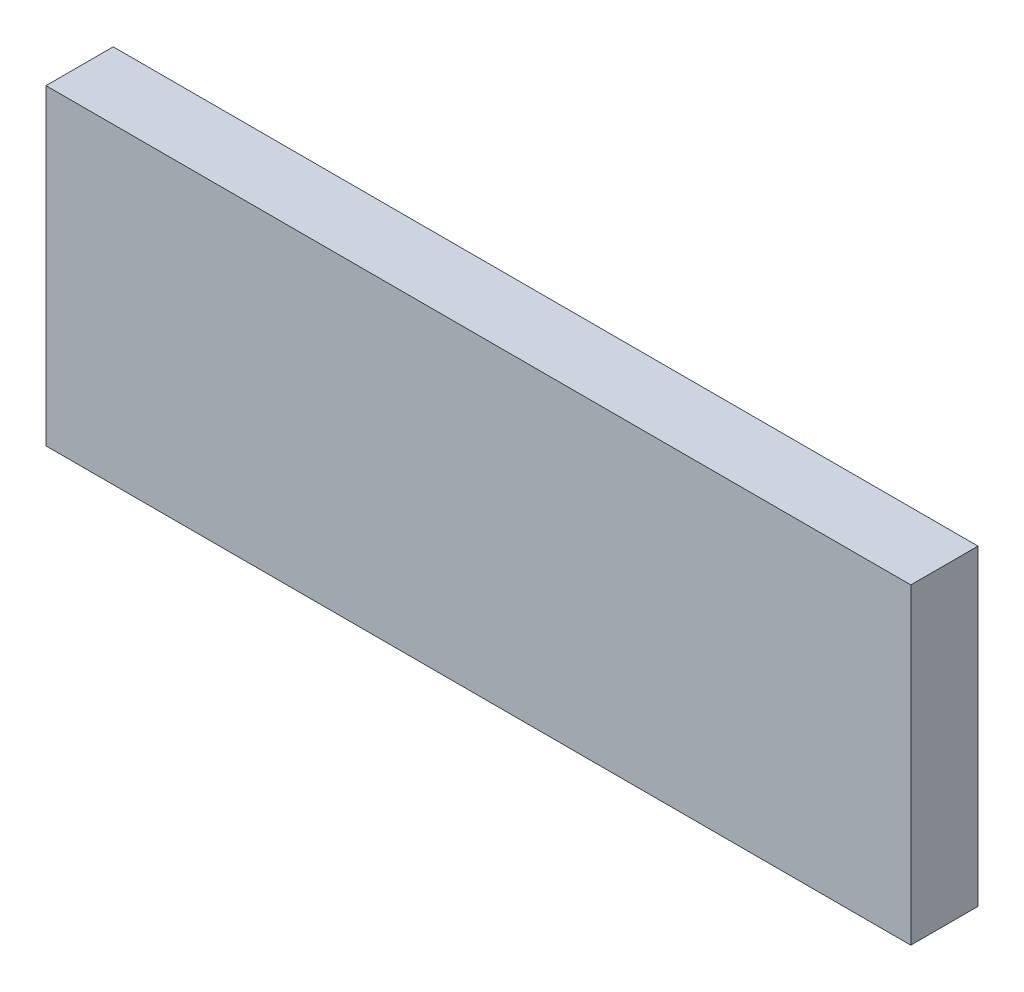
ISO-10303-21;
HEADER;
FILE_DESCRIPTION(('STEP AP214'),'2;1');
FILE_NAME('part.step','',(''),(''),'','','');
FILE_SCHEMA(('AUTOMOTIVE_DESIGN { 1 0 10303 214 1 1 1 1 }'));
ENDSEC;
DATA;
#1=APPLICATION_CONTEXT('core data for automotive mechanical design processes');
#2=APPLICATION_PROTOCOL_DEFINITION('international standard','automotive_design',2000,#1);
#3=PRODUCT_CONTEXT('',#1,'mechanical');
#4=PRODUCT('Part','Part','',(#3));
#5=PRODUCT_RELATED_PRODUCT_CATEGORY('part','',(#4));
#6=PRODUCT_DEFINITION_FORMATION('','',#4);
#7=PRODUCT_DEFINITION_CONTEXT('part definition',#1,'design');
#8=PRODUCT_DEFINITION('design','',#6,#7);
#9=PRODUCT_DEFINITION_SHAPE('','',#8);
#10=(LENGTH_UNIT() NAMED_UNIT(*) SI_UNIT(.MILLI.,.METRE.));
#11=(NAMED_UNIT(*) PLANE_ANGLE_UNIT() SI_UNIT($,.RADIAN.));
#12=(NAMED_UNIT(*) SI_UNIT($,.STERADIAN.) SOLID_ANGLE_UNIT());
#13=UNCERTAINTY_MEASURE_WITH_UNIT(LENGTH_MEASURE(1.E-05),#10,'distance_accuracy_value','');
#14=(GEOMETRIC_REPRESENTATION_CONTEXT(3) GLOBAL_UNCERTAINTY_ASSIGNED_CONTEXT((#13)) GLOBAL_UNIT_ASSIGNED_CONTEXT((#10,
#11,#12)) REPRESENTATION_CONTEXT('',''));
#15=CARTESIAN_POINT('',(0.,0.,0.));
#16=DIRECTION('',(0.,0.,1.));
#17=DIRECTION('',(1.,0.,0.));
#18=AXIS2_PLACEMENT_3D('',#15,#16,#17);
#19=CARTESIAN_POINT('',(-36.7020403086607,21.4105311355311,6.));
#20=DIRECTION('',(1.,0.,0.));
#21=DIRECTION('',(0.,0.,-1.));
#22=AXIS2_PLACEMENT_3D('',#19,#20,#21);
#23=PLANE('',#22);
#24=DIRECTION('',(0.,-1.,0.));
#25=VECTOR('',#24,1.);
#26=CARTESIAN_POINT('',(-36.7020403086607,21.4105311355311,0.));
#27=LINE('',#26,#25);
#28=CARTESIAN_POINT('',(-36.7020403086607,21.4105311355311,0.));
#29=VERTEX_POINT('',#28);
#30=CARTESIAN_POINT('',(-36.7020403086607,-6.43946886446888,0.));
#31=VERTEX_POINT('',#30);
#32=EDGE_CURVE('E97',#29,#31,#27,.T.);
#33=ORIENTED_EDGE('',*,*,#32,.T.);
#34=DIRECTION('',(0.,0.,-1.));
#35=VECTOR('',#34,1.);
#36=CARTESIAN_POINT('',(-36.7020403086607,-6.43946886446888,6.));
#37=LINE('',#36,#35);
#38=CARTESIAN_POINT('',(-36.7020403086607,-6.43946886446888,6.));
#39=VERTEX_POINT('',#38);
#40=EDGE_CURVE('E11',#39,#31,#37,.T.);
#41=ORIENTED_EDGE('',*,*,#40,.F.);
#42=DIRECTION('',(0.,-1.,0.));
#43=VECTOR('',#42,1.);
#44=CARTESIAN_POINT('',(-36.7020403086607,21.4105311355311,6.));
#45=LINE('',#44,#43);
#46=CARTESIAN_POINT('',(-36.7020403086607,21.4105311355311,6.));
#47=VERTEX_POINT('',#46);
#48=EDGE_CURVE('E80',#47,#39,#45,.T.);
#49=ORIENTED_EDGE('',*,*,#48,.F.);
#50=DIRECTION('',(0.,0.,-1.));
#51=VECTOR('',#50,1.);
#52=CARTESIAN_POINT('',(-36.7020403086607,21.4105311355311,6.));
#53=LINE('',#52,#51);
#54=EDGE_CURVE('E41',#47,#29,#53,.T.);
#55=ORIENTED_EDGE('',*,*,#54,.T.);
#56=EDGE_LOOP('',(#33,#41,#49,#55));
#57=FACE_BOUND('',#56,.T.);
#58=ADVANCED_FACE('F33',(#57),#23,.F.);
#59=CARTESIAN_POINT('',(-36.7020403086607,-6.43946886446888,6.));
#60=DIRECTION('',(0.,1.,0.));
#61=DIRECTION('',(0.,0.,1.));
#62=AXIS2_PLACEMENT_3D('',#59,#60,#61);
#63=PLANE('',#62);
#64=DIRECTION('',(1.,0.,0.));
#65=VECTOR('',#64,1.);
#66=CARTESIAN_POINT('',(-36.7020403086607,-6.43946886446888,0.));
#67=LINE('',#66,#65);
#68=CARTESIAN_POINT('',(40.4879596913393,-6.43946886446888,0.));
#69=VERTEX_POINT('',#68);
#70=EDGE_CURVE('E61',#31,#69,#67,.T.);
#71=ORIENTED_EDGE('',*,*,#70,.T.);
#72=DIRECTION('',(0.,0.,-1.));
#73=VECTOR('',#72,1.);
#74=CARTESIAN_POINT('',(40.4879596913393,-6.43946886446888,6.));
#75=LINE('',#74,#73);
#76=CARTESIAN_POINT('',(40.4879596913393,-6.43946886446888,6.));
#77=VERTEX_POINT('',#76);
#78=EDGE_CURVE('E85',#77,#69,#75,.T.);
#79=ORIENTED_EDGE('',*,*,#78,.F.);
#80=DIRECTION('',(1.,0.,0.));
#81=VECTOR('',#80,1.);
#82=CARTESIAN_POINT('',(-36.7020403086607,-6.43946886446888,6.));
#83=LINE('',#82,#81);
#84=EDGE_CURVE('E74',#39,#77,#83,.T.);
#85=ORIENTED_EDGE('',*,*,#84,.F.);
#86=ORIENTED_EDGE('',*,*,#40,.T.);
#87=EDGE_LOOP('',(#71,#79,#85,#86));
#88=FACE_BOUND('',#87,.T.);
#89=ADVANCED_FACE('F86',(#88),#63,.F.);
#90=CARTESIAN_POINT('',(-36.7020403086607,21.4105311355311,6.));
#91=DIRECTION('',(0.,-1.,0.));
#92=DIRECTION('',(0.,0.,-1.));
#93=AXIS2_PLACEMENT_3D('',#90,#91,#92);
#94=PLANE('',#93);
#95=DIRECTION('',(-1.,0.,0.));
#96=VECTOR('',#95,1.);
#97=CARTESIAN_POINT('',(-36.7020403086607,21.4105311355311,0.));
#98=LINE('',#97,#96);
#99=CARTESIAN_POINT('',(40.4879596913393,21.4105311355311,0.));
#100=VERTEX_POINT('',#99);
#101=EDGE_CURVE('E98',#100,#29,#98,.T.);
#102=ORIENTED_EDGE('',*,*,#101,.T.);
#103=ORIENTED_EDGE('',*,*,#54,.F.);
#104=DIRECTION('',(-1.,0.,0.));
#105=VECTOR('',#104,1.);
#106=CARTESIAN_POINT('',(-36.7020403086607,21.4105311355311,6.));
#107=LINE('',#106,#105);
#108=CARTESIAN_POINT('',(40.4879596913393,21.4105311355311,6.));
#109=VERTEX_POINT('',#108);
#110=EDGE_CURVE('E49',#109,#47,#107,.T.);
#111=ORIENTED_EDGE('',*,*,#110,.F.);
#112=DIRECTION('',(0.,0.,1.));
#113=VECTOR('',#112,1.);
#114=CARTESIAN_POINT('',(40.4879596913393,21.4105311355311,6.));
#115=LINE('',#114,#113);
#116=EDGE_CURVE('E92',#100,#109,#115,.T.);
#117=ORIENTED_EDGE('',*,*,#116,.F.);
#118=EDGE_LOOP('',(#102,#103,#111,#117));
#119=FACE_BOUND('',#118,.T.);
#120=ADVANCED_FACE('F107',(#119),#94,.F.);
#121=CARTESIAN_POINT('',(0.,0.,6.));
#122=DIRECTION('',(0.,0.,1.));
#123=DIRECTION('',(1.,0.,0.));
#124=AXIS2_PLACEMENT_3D('',#121,#122,#123);
#125=PLANE('',#124);
#126=ORIENTED_EDGE('',*,*,#48,.T.);
#127=ORIENTED_EDGE('',*,*,#84,.T.);
#128=DIRECTION('',(0.,-1.,0.));
#129=VECTOR('',#128,1.);
#130=CARTESIAN_POINT('',(40.4879596913393,-6.43946886446888,6.));
#131=LINE('',#130,#129);
#132=EDGE_CURVE('E78',#109,#77,#131,.T.);
#133=ORIENTED_EDGE('',*,*,#132,.F.);
#134=ORIENTED_EDGE('',*,*,#110,.T.);
#135=EDGE_LOOP('',(#126,#127,#133,#134));
#136=FACE_BOUND('',#135,.T.);
#137=ADVANCED_FACE('F76',(#136),#125,.T.);
#138=CARTESIAN_POINT('',(0.,0.,0.));
#139=DIRECTION('',(0.,0.,1.));
#140=DIRECTION('',(1.,0.,0.));
#141=AXIS2_PLACEMENT_3D('',#138,#139,#140);
#142=PLANE('',#141);
#143=ORIENTED_EDGE('',*,*,#32,.F.);
#144=ORIENTED_EDGE('',*,*,#101,.F.);
#145=DIRECTION('',(0.,1.,0.));
#146=VECTOR('',#145,1.);
#147=CARTESIAN_POINT('',(40.4879596913393,-6.43946886446888,0.));
#148=LINE('',#147,#146);
#149=EDGE_CURVE('E89',#69,#100,#148,.T.);
#150=ORIENTED_EDGE('',*,*,#149,.F.);
#151=ORIENTED_EDGE('',*,*,#70,.F.);
#152=EDGE_LOOP('',(#143,#144,#150,#151));
#153=FACE_BOUND('',#152,.T.);
#154=ADVANCED_FACE('F106',(#153),#142,.F.);
#155=CARTESIAN_POINT('',(40.4879596913393,0.,0.));
#156=DIRECTION('',(-1.,0.,0.));
#157=DIRECTION('',(0.,0.,1.));
#158=AXIS2_PLACEMENT_3D('',#155,#156,#157);
#159=PLANE('',#158);
#160=ORIENTED_EDGE('',*,*,#132,.T.);
#161=ORIENTED_EDGE('',*,*,#78,.T.);
#162=ORIENTED_EDGE('',*,*,#149,.T.);
#163=ORIENTED_EDGE('',*,*,#116,.T.);
#164=EDGE_LOOP('',(#160,#161,#162,#163));
#165=FACE_BOUND('',#164,.T.);
#166=ADVANCED_FACE('F91',(#165),#159,.F.);
#167=CLOSED_SHELL('',(#58,#89,#120,#137,#154,#166));
#168=MANIFOLD_SOLID_BREP('B2',#167);
#169=ADVANCED_BREP_SHAPE_REPRESENTATION('',(#18,#168),#14);
#170=SHAPE_DEFINITION_REPRESENTATION(#9,#169);
ENDSEC;
END-ISO-10303-21;
